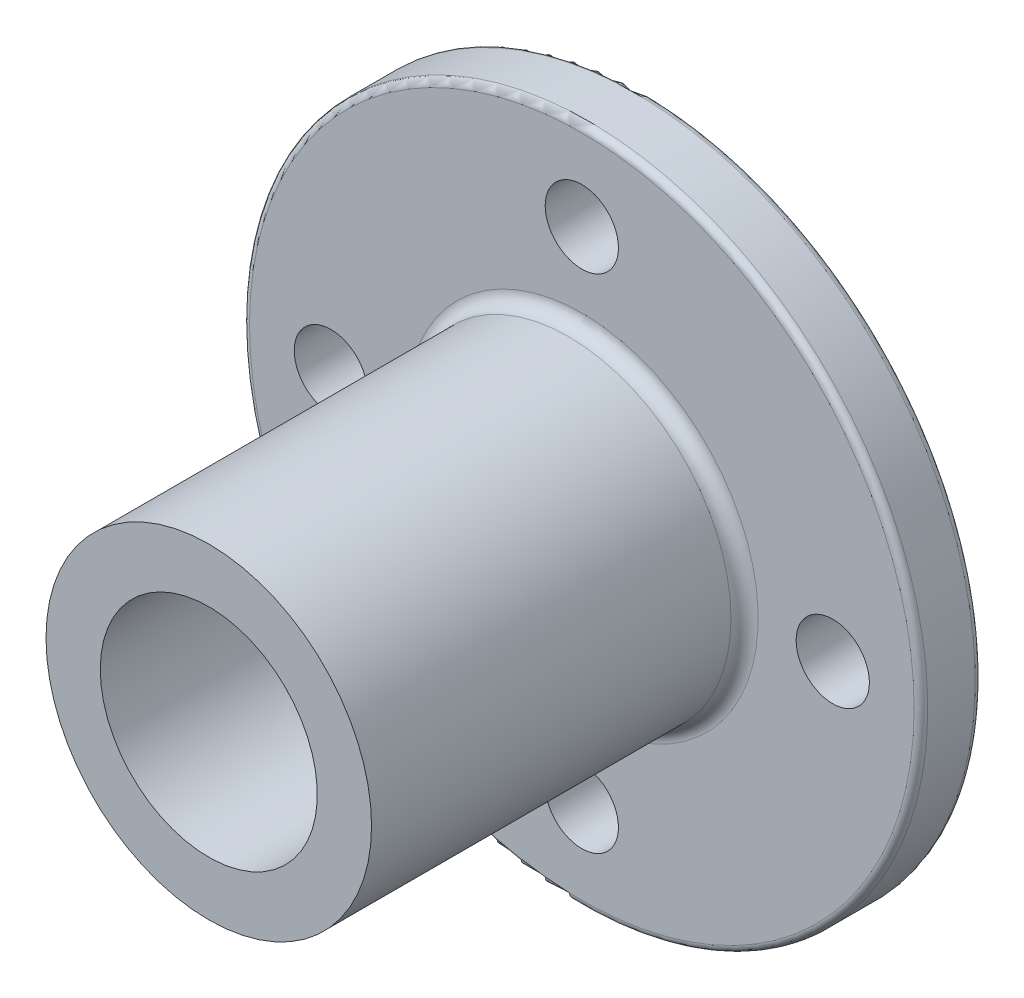
ISO-10303-21;
HEADER;
FILE_DESCRIPTION(('STEP AP214'),'2;1');
FILE_NAME('part.step','',(''),(''),'','','');
FILE_SCHEMA(('AUTOMOTIVE_DESIGN { 1 0 10303 214 1 1 1 1 }'));
ENDSEC;
DATA;
#1=APPLICATION_CONTEXT('core data for automotive mechanical design processes');
#2=APPLICATION_PROTOCOL_DEFINITION('international standard','automotive_design',2000,#1);
#3=PRODUCT_CONTEXT('',#1,'mechanical');
#4=PRODUCT('Part','Part','',(#3));
#5=PRODUCT_RELATED_PRODUCT_CATEGORY('part','',(#4));
#6=PRODUCT_DEFINITION_FORMATION('','',#4);
#7=PRODUCT_DEFINITION_CONTEXT('part definition',#1,'design');
#8=PRODUCT_DEFINITION('design','',#6,#7);
#9=PRODUCT_DEFINITION_SHAPE('','',#8);
#10=(LENGTH_UNIT() NAMED_UNIT(*) SI_UNIT(.MILLI.,.METRE.));
#11=(NAMED_UNIT(*) PLANE_ANGLE_UNIT() SI_UNIT($,.RADIAN.));
#12=(NAMED_UNIT(*) SI_UNIT($,.STERADIAN.) SOLID_ANGLE_UNIT());
#13=UNCERTAINTY_MEASURE_WITH_UNIT(LENGTH_MEASURE(1.E-05),#10,'distance_accuracy_value','');
#14=(GEOMETRIC_REPRESENTATION_CONTEXT(3) GLOBAL_UNCERTAINTY_ASSIGNED_CONTEXT((#13)) GLOBAL_UNIT_ASSIGNED_CONTEXT((#10,
#11,#12)) REPRESENTATION_CONTEXT('',''));
#15=CARTESIAN_POINT('',(0.,0.,0.));
#16=DIRECTION('',(0.,0.,1.));
#17=DIRECTION('',(1.,0.,0.));
#18=AXIS2_PLACEMENT_3D('',#15,#16,#17);
#19=CARTESIAN_POINT('',(0.,8.,16.));
#20=DIRECTION('',(0.,0.,1.));
#21=DIRECTION('',(1.,0.,0.));
#22=AXIS2_PLACEMENT_3D('',#19,#20,#21);
#23=PLANE('',#22);
#24=CARTESIAN_POINT('',(0.,0.,16.));
#25=DIRECTION('',(0.,0.,-1.));
#26=DIRECTION('',(-1.,0.,0.));
#27=AXIS2_PLACEMENT_3D('',#24,#25,#26);
#28=CIRCLE('',#27,8.);
#29=CARTESIAN_POINT('',(-8.,0.,16.));
#30=VERTEX_POINT('',#29);
#31=EDGE_CURVE('E90',#30,#30,#28,.T.);
#32=ORIENTED_EDGE('',*,*,#31,.T.);
#33=EDGE_LOOP('',(#32));
#34=FACE_BOUND('',#33,.T.);
#35=CARTESIAN_POINT('',(0.,0.,16.));
#36=DIRECTION('',(0.,0.,-1.));
#37=DIRECTION('',(-1.,0.,0.));
#38=AXIS2_PLACEMENT_3D('',#35,#36,#37);
#39=CIRCLE('',#38,12.);
#40=CARTESIAN_POINT('',(-12.,0.,16.));
#41=VERTEX_POINT('',#40);
#42=EDGE_CURVE('E10',#41,#41,#39,.T.);
#43=ORIENTED_EDGE('',*,*,#42,.F.);
#44=EDGE_LOOP('',(#43));
#45=FACE_BOUND('',#44,.T.);
#46=ADVANCED_FACE('F43',(#34,#45),#23,.T.);
#47=CARTESIAN_POINT('',(0.,0.,0.));
#48=DIRECTION('',(0.,0.,-1.));
#49=DIRECTION('',(-1.,0.,0.));
#50=AXIS2_PLACEMENT_3D('',#47,#48,#49);
#51=CYLINDRICAL_SURFACE('',#50,12.);
#52=ORIENTED_EDGE('',*,*,#42,.T.);
#53=EDGE_LOOP('',(#52));
#54=FACE_BOUND('',#53,.T.);
#55=CARTESIAN_POINT('',(0.,0.,-10.5));
#56=DIRECTION('',(0.,0.,-1.));
#57=DIRECTION('',(-1.,0.,0.));
#58=AXIS2_PLACEMENT_3D('',#55,#56,#57);
#59=CIRCLE('',#58,12.);
#60=CARTESIAN_POINT('',(-12.,0.,-10.5));
#61=VERTEX_POINT('',#60);
#62=EDGE_CURVE('E51',#61,#61,#59,.T.);
#63=ORIENTED_EDGE('',*,*,#62,.F.);
#64=EDGE_LOOP('',(#63));
#65=FACE_BOUND('',#64,.T.);
#66=ADVANCED_FACE('F122',(#54,#65),#51,.T.);
#67=CARTESIAN_POINT('',(0.,0.,-10.5));
#68=DIRECTION('',(0.,0.,-1.));
#69=DIRECTION('',(-1.,0.,0.));
#70=AXIS2_PLACEMENT_3D('',#67,#68,#69);
#71=TOROIDAL_SURFACE('',#70,13.,1.);
#72=ORIENTED_EDGE('',*,*,#62,.T.);
#73=EDGE_LOOP('',(#72));
#74=FACE_BOUND('',#73,.T.);
#75=CARTESIAN_POINT('',(0.,0.,-11.5));
#76=DIRECTION('',(0.,0.,-1.));
#77=DIRECTION('',(-1.,0.,0.));
#78=AXIS2_PLACEMENT_3D('',#75,#76,#77);
#79=CIRCLE('',#78,13.);
#80=CARTESIAN_POINT('',(-13.,0.,-11.5));
#81=VERTEX_POINT('',#80);
#82=EDGE_CURVE('E57',#81,#81,#79,.T.);
#83=ORIENTED_EDGE('',*,*,#82,.F.);
#84=EDGE_LOOP('',(#83));
#85=FACE_BOUND('',#84,.T.);
#86=ADVANCED_FACE('F120',(#74,#85),#71,.F.);
#87=CARTESIAN_POINT('',(0.,24.5,-11.5));
#88=DIRECTION('',(0.,0.,1.));
#89=DIRECTION('',(1.,0.,0.));
#90=AXIS2_PLACEMENT_3D('',#87,#88,#89);
#91=PLANE('',#90);
#92=CARTESIAN_POINT('',(0.,18.5,-11.5));
#93=DIRECTION('',(0.,0.,1.));
#94=DIRECTION('',(1.,0.,0.));
#95=AXIS2_PLACEMENT_3D('',#92,#93,#94);
#96=CIRCLE('',#95,2.7);
#97=CARTESIAN_POINT('',(2.7,18.5,-11.5));
#98=VERTEX_POINT('',#97);
#99=EDGE_CURVE('E86',#98,#98,#96,.T.);
#100=ORIENTED_EDGE('',*,*,#99,.F.);
#101=EDGE_LOOP('',(#100));
#102=FACE_BOUND('',#101,.T.);
#103=CARTESIAN_POINT('',(-18.5,0.,-11.5));
#104=DIRECTION('',(0.,0.,1.));
#105=DIRECTION('',(1.,0.,0.));
#106=AXIS2_PLACEMENT_3D('',#103,#104,#105);
#107=CIRCLE('',#106,2.7);
#108=CARTESIAN_POINT('',(-15.8,0.,-11.5));
#109=VERTEX_POINT('',#108);
#110=EDGE_CURVE('E73',#109,#109,#107,.T.);
#111=ORIENTED_EDGE('',*,*,#110,.F.);
#112=EDGE_LOOP('',(#111));
#113=FACE_BOUND('',#112,.T.);
#114=CARTESIAN_POINT('',(0.,-18.5,-11.5));
#115=DIRECTION('',(0.,0.,1.));
#116=DIRECTION('',(1.,0.,0.));
#117=AXIS2_PLACEMENT_3D('',#114,#115,#116);
#118=CIRCLE('',#117,2.7);
#119=CARTESIAN_POINT('',(2.7,-18.5,-11.5));
#120=VERTEX_POINT('',#119);
#121=EDGE_CURVE('E69',#120,#120,#118,.T.);
#122=ORIENTED_EDGE('',*,*,#121,.F.);
#123=EDGE_LOOP('',(#122));
#124=FACE_BOUND('',#123,.T.);
#125=CARTESIAN_POINT('',(18.5,0.,-11.5));
#126=DIRECTION('',(0.,0.,1.));
#127=DIRECTION('',(1.,0.,0.));
#128=AXIS2_PLACEMENT_3D('',#125,#126,#127);
#129=CIRCLE('',#128,2.7);
#130=CARTESIAN_POINT('',(21.2,0.,-11.5));
#131=VERTEX_POINT('',#130);
#132=EDGE_CURVE('E65',#131,#131,#129,.T.);
#133=ORIENTED_EDGE('',*,*,#132,.F.);
#134=EDGE_LOOP('',(#133));
#135=FACE_BOUND('',#134,.T.);
#136=ORIENTED_EDGE('',*,*,#82,.T.);
#137=EDGE_LOOP('',(#136));
#138=FACE_BOUND('',#137,.T.);
#139=CARTESIAN_POINT('',(0.,0.,-11.5));
#140=DIRECTION('',(0.,0.,-1.));
#141=DIRECTION('',(-1.,0.,0.));
#142=AXIS2_PLACEMENT_3D('',#139,#140,#141);
#143=CIRCLE('',#142,24.5);
#144=CARTESIAN_POINT('',(-24.5,0.,-11.5));
#145=VERTEX_POINT('',#144);
#146=EDGE_CURVE('E110',#145,#145,#143,.T.);
#147=ORIENTED_EDGE('',*,*,#146,.F.);
#148=EDGE_LOOP('',(#147));
#149=FACE_BOUND('',#148,.T.);
#150=ADVANCED_FACE('F117',(#102,#113,#124,#135,#138,#149),#91,.T.);
#151=CARTESIAN_POINT('',(0.,0.,-12.));
#152=DIRECTION('',(0.,0.,-1.));
#153=DIRECTION('',(-1.,0.,0.));
#154=AXIS2_PLACEMENT_3D('',#151,#152,#153);
#155=TOROIDAL_SURFACE('',#154,24.5,0.500000000000002);
#156=ORIENTED_EDGE('',*,*,#146,.T.);
#157=EDGE_LOOP('',(#156));
#158=FACE_BOUND('',#157,.T.);
#159=CARTESIAN_POINT('',(0.,0.,-12.));
#160=DIRECTION('',(0.,0.,-1.));
#161=DIRECTION('',(-1.,0.,0.));
#162=AXIS2_PLACEMENT_3D('',#159,#160,#161);
#163=CIRCLE('',#162,25.);
#164=CARTESIAN_POINT('',(-25.,0.,-12.));
#165=VERTEX_POINT('',#164);
#166=EDGE_CURVE('E106',#165,#165,#163,.T.);
#167=ORIENTED_EDGE('',*,*,#166,.F.);
#168=EDGE_LOOP('',(#167));
#169=FACE_BOUND('',#168,.T.);
#170=ADVANCED_FACE('F130',(#158,#169),#155,.T.);
#171=CARTESIAN_POINT('',(0.,0.,0.));
#172=DIRECTION('',(0.,0.,-1.));
#173=DIRECTION('',(-1.,0.,0.));
#174=AXIS2_PLACEMENT_3D('',#171,#172,#173);
#175=CYLINDRICAL_SURFACE('',#174,25.);
#176=ORIENTED_EDGE('',*,*,#166,.T.);
#177=EDGE_LOOP('',(#176));
#178=FACE_BOUND('',#177,.T.);
#179=CARTESIAN_POINT('',(0.,0.,-15.5));
#180=DIRECTION('',(0.,0.,-1.));
#181=DIRECTION('',(-1.,0.,0.));
#182=AXIS2_PLACEMENT_3D('',#179,#180,#181);
#183=CIRCLE('',#182,25.);
#184=CARTESIAN_POINT('',(-25.,0.,-15.5));
#185=VERTEX_POINT('',#184);
#186=EDGE_CURVE('E102',#185,#185,#183,.T.);
#187=ORIENTED_EDGE('',*,*,#186,.F.);
#188=EDGE_LOOP('',(#187));
#189=FACE_BOUND('',#188,.T.);
#190=ADVANCED_FACE('F160',(#178,#189),#175,.T.);
#191=CARTESIAN_POINT('',(0.,0.,-15.5));
#192=DIRECTION('',(0.,0.,-1.));
#193=DIRECTION('',(-1.,0.,0.));
#194=AXIS2_PLACEMENT_3D('',#191,#192,#193);
#195=TOROIDAL_SURFACE('',#194,24.5,0.500000000000002);
#196=ORIENTED_EDGE('',*,*,#186,.T.);
#197=EDGE_LOOP('',(#196));
#198=FACE_BOUND('',#197,.T.);
#199=CARTESIAN_POINT('',(0.,0.,-16.));
#200=DIRECTION('',(0.,0.,-1.));
#201=DIRECTION('',(-1.,0.,0.));
#202=AXIS2_PLACEMENT_3D('',#199,#200,#201);
#203=CIRCLE('',#202,24.5);
#204=CARTESIAN_POINT('',(-24.5,0.,-16.));
#205=VERTEX_POINT('',#204);
#206=EDGE_CURVE('E98',#205,#205,#203,.T.);
#207=ORIENTED_EDGE('',*,*,#206,.F.);
#208=EDGE_LOOP('',(#207));
#209=FACE_BOUND('',#208,.T.);
#210=ADVANCED_FACE('F154',(#198,#209),#195,.T.);
#211=CARTESIAN_POINT('',(0.,8.,-16.));
#212=DIRECTION('',(0.,0.,-1.));
#213=DIRECTION('',(-1.,0.,0.));
#214=AXIS2_PLACEMENT_3D('',#211,#212,#213);
#215=PLANE('',#214);
#216=CARTESIAN_POINT('',(0.,18.5,-16.));
#217=DIRECTION('',(0.,0.,-1.));
#218=DIRECTION('',(-1.,0.,0.));
#219=AXIS2_PLACEMENT_3D('',#216,#217,#218);
#220=CIRCLE('',#219,2.7);
#221=CARTESIAN_POINT('',(-2.7,18.5,-16.));
#222=VERTEX_POINT('',#221);
#223=EDGE_CURVE('E46',#222,#222,#220,.T.);
#224=ORIENTED_EDGE('',*,*,#223,.F.);
#225=EDGE_LOOP('',(#224));
#226=FACE_BOUND('',#225,.T.);
#227=CARTESIAN_POINT('',(-18.5,0.,-16.));
#228=DIRECTION('',(0.,0.,-1.));
#229=DIRECTION('',(-1.,0.,0.));
#230=AXIS2_PLACEMENT_3D('',#227,#228,#229);
#231=CIRCLE('',#230,2.7);
#232=CARTESIAN_POINT('',(-21.2,0.,-16.));
#233=VERTEX_POINT('',#232);
#234=EDGE_CURVE('E70',#233,#233,#231,.T.);
#235=ORIENTED_EDGE('',*,*,#234,.F.);
#236=EDGE_LOOP('',(#235));
#237=FACE_BOUND('',#236,.T.);
#238=CARTESIAN_POINT('',(0.,-18.5,-16.));
#239=DIRECTION('',(0.,0.,-1.));
#240=DIRECTION('',(-1.,0.,0.));
#241=AXIS2_PLACEMENT_3D('',#238,#239,#240);
#242=CIRCLE('',#241,2.7);
#243=CARTESIAN_POINT('',(-2.7,-18.5,-16.));
#244=VERTEX_POINT('',#243);
#245=EDGE_CURVE('E66',#244,#244,#242,.T.);
#246=ORIENTED_EDGE('',*,*,#245,.F.);
#247=EDGE_LOOP('',(#246));
#248=FACE_BOUND('',#247,.T.);
#249=CARTESIAN_POINT('',(18.5,0.,-16.));
#250=DIRECTION('',(0.,0.,-1.));
#251=DIRECTION('',(-1.,0.,0.));
#252=AXIS2_PLACEMENT_3D('',#249,#250,#251);
#253=CIRCLE('',#252,2.7);
#254=CARTESIAN_POINT('',(15.8,0.,-16.));
#255=VERTEX_POINT('',#254);
#256=EDGE_CURVE('E61',#255,#255,#253,.T.);
#257=ORIENTED_EDGE('',*,*,#256,.F.);
#258=EDGE_LOOP('',(#257));
#259=FACE_BOUND('',#258,.T.);
#260=ORIENTED_EDGE('',*,*,#206,.T.);
#261=EDGE_LOOP('',(#260));
#262=FACE_BOUND('',#261,.T.);
#263=CARTESIAN_POINT('',(0.,0.,-16.));
#264=DIRECTION('',(0.,0.,-1.));
#265=DIRECTION('',(-1.,0.,0.));
#266=AXIS2_PLACEMENT_3D('',#263,#264,#265);
#267=CIRCLE('',#266,8.);
#268=CARTESIAN_POINT('',(-8.,0.,-16.));
#269=VERTEX_POINT('',#268);
#270=EDGE_CURVE('E94',#269,#269,#267,.T.);
#271=ORIENTED_EDGE('',*,*,#270,.F.);
#272=EDGE_LOOP('',(#271));
#273=FACE_BOUND('',#272,.T.);
#274=ADVANCED_FACE('F143',(#226,#237,#248,#259,#262,#273),#215,.T.);
#275=CARTESIAN_POINT('',(0.,0.,0.));
#276=DIRECTION('',(0.,0.,-1.));
#277=DIRECTION('',(-1.,0.,0.));
#278=AXIS2_PLACEMENT_3D('',#275,#276,#277);
#279=CYLINDRICAL_SURFACE('',#278,8.);
#280=ORIENTED_EDGE('',*,*,#270,.T.);
#281=EDGE_LOOP('',(#280));
#282=FACE_BOUND('',#281,.T.);
#283=ORIENTED_EDGE('',*,*,#31,.F.);
#284=EDGE_LOOP('',(#283));
#285=FACE_BOUND('',#284,.T.);
#286=ADVANCED_FACE('F140',(#282,#285),#279,.F.);
#287=CARTESIAN_POINT('',(18.5,0.,16.));
#288=DIRECTION('',(0.,0.,-1.));
#289=DIRECTION('',(-1.,0.,0.));
#290=AXIS2_PLACEMENT_3D('',#287,#288,#289);
#291=CYLINDRICAL_SURFACE('',#290,2.7);
#292=ORIENTED_EDGE('',*,*,#132,.T.);
#293=EDGE_LOOP('',(#292));
#294=FACE_BOUND('',#293,.T.);
#295=ORIENTED_EDGE('',*,*,#256,.T.);
#296=EDGE_LOOP('',(#295));
#297=FACE_BOUND('',#296,.T.);
#298=ADVANCED_FACE('F142',(#294,#297),#291,.F.);
#299=CARTESIAN_POINT('',(0.,-18.5,16.));
#300=DIRECTION('',(0.,0.,-1.));
#301=DIRECTION('',(-1.,0.,0.));
#302=AXIS2_PLACEMENT_3D('',#299,#300,#301);
#303=CYLINDRICAL_SURFACE('',#302,2.7);
#304=ORIENTED_EDGE('',*,*,#121,.T.);
#305=EDGE_LOOP('',(#304));
#306=FACE_BOUND('',#305,.T.);
#307=ORIENTED_EDGE('',*,*,#245,.T.);
#308=EDGE_LOOP('',(#307));
#309=FACE_BOUND('',#308,.T.);
#310=ADVANCED_FACE('F150',(#306,#309),#303,.F.);
#311=CARTESIAN_POINT('',(-18.5,0.,16.));
#312=DIRECTION('',(0.,0.,-1.));
#313=DIRECTION('',(-1.,0.,0.));
#314=AXIS2_PLACEMENT_3D('',#311,#312,#313);
#315=CYLINDRICAL_SURFACE('',#314,2.7);
#316=ORIENTED_EDGE('',*,*,#110,.T.);
#317=EDGE_LOOP('',(#316));
#318=FACE_BOUND('',#317,.T.);
#319=ORIENTED_EDGE('',*,*,#234,.T.);
#320=EDGE_LOOP('',(#319));
#321=FACE_BOUND('',#320,.T.);
#322=ADVANCED_FACE('F215',(#318,#321),#315,.F.);
#323=CARTESIAN_POINT('',(0.,18.5,16.));
#324=DIRECTION('',(0.,0.,-1.));
#325=DIRECTION('',(-1.,0.,0.));
#326=AXIS2_PLACEMENT_3D('',#323,#324,#325);
#327=CYLINDRICAL_SURFACE('',#326,2.7);
#328=ORIENTED_EDGE('',*,*,#99,.T.);
#329=EDGE_LOOP('',(#328));
#330=FACE_BOUND('',#329,.T.);
#331=ORIENTED_EDGE('',*,*,#223,.T.);
#332=EDGE_LOOP('',(#331));
#333=FACE_BOUND('',#332,.T.);
#334=ADVANCED_FACE('F223',(#330,#333),#327,.F.);
#335=CLOSED_SHELL('',(#46,#66,#86,#150,#170,#190,#210,#274,#286,#298,#310,#322,#334));
#336=MANIFOLD_SOLID_BREP('B2',#335);
#337=ADVANCED_BREP_SHAPE_REPRESENTATION('',(#18,#336),#14);
#338=SHAPE_DEFINITION_REPRESENTATION(#9,#337);
ENDSEC;
END-ISO-10303-21;
